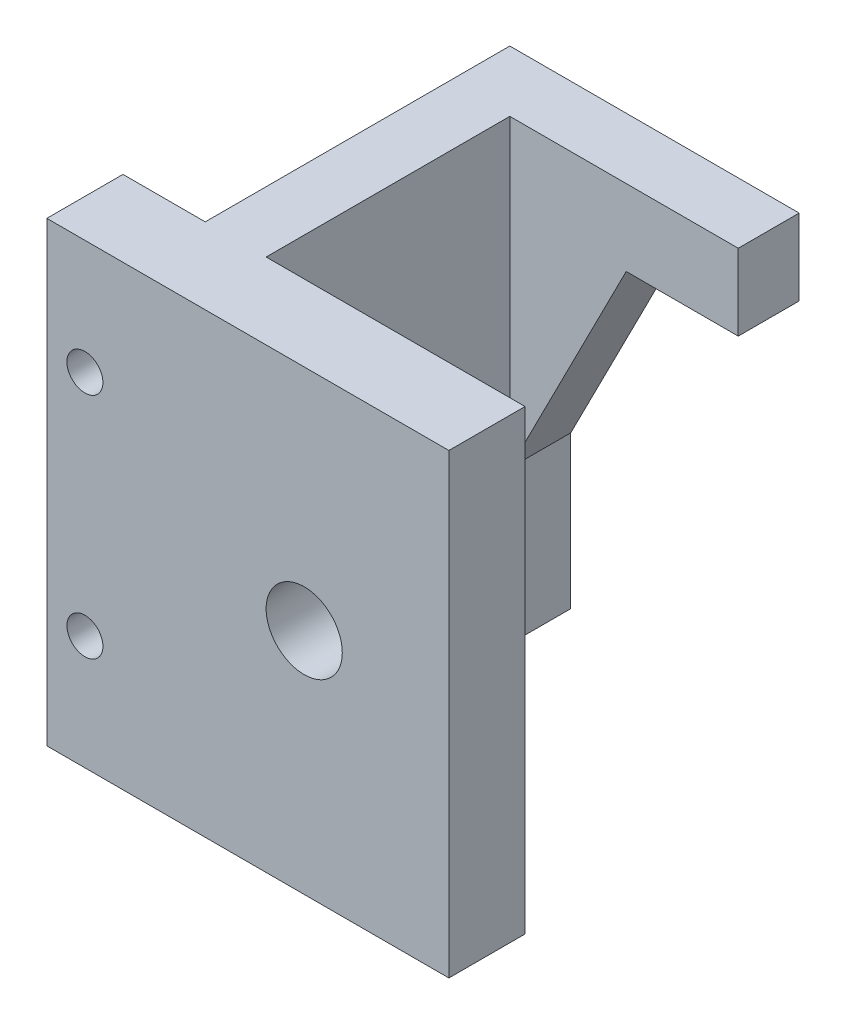
ISO-10303-21;
HEADER;
FILE_DESCRIPTION(('STEP AP214'),'2;1');
FILE_NAME('part.step','',(''),(''),'','','');
FILE_SCHEMA(('AUTOMOTIVE_DESIGN { 1 0 10303 214 1 1 1 1 }'));
ENDSEC;
DATA;
#1=APPLICATION_CONTEXT('core data for automotive mechanical design processes');
#2=APPLICATION_PROTOCOL_DEFINITION('international standard','automotive_design',2000,#1);
#3=PRODUCT_CONTEXT('',#1,'mechanical');
#4=PRODUCT('Part','Part','',(#3));
#5=PRODUCT_RELATED_PRODUCT_CATEGORY('part','',(#4));
#6=PRODUCT_DEFINITION_FORMATION('','',#4);
#7=PRODUCT_DEFINITION_CONTEXT('part definition',#1,'design');
#8=PRODUCT_DEFINITION('design','',#6,#7);
#9=PRODUCT_DEFINITION_SHAPE('','',#8);
#10=(LENGTH_UNIT() NAMED_UNIT(*) SI_UNIT(.MILLI.,.METRE.));
#11=(NAMED_UNIT(*) PLANE_ANGLE_UNIT() SI_UNIT($,.RADIAN.));
#12=(NAMED_UNIT(*) SI_UNIT($,.STERADIAN.) SOLID_ANGLE_UNIT());
#13=UNCERTAINTY_MEASURE_WITH_UNIT(LENGTH_MEASURE(1.E-05),#10,'distance_accuracy_value','');
#14=(GEOMETRIC_REPRESENTATION_CONTEXT(3) GLOBAL_UNCERTAINTY_ASSIGNED_CONTEXT((#13)) GLOBAL_UNIT_ASSIGNED_CONTEXT((#10,
#11,#12)) REPRESENTATION_CONTEXT('',''));
#15=CARTESIAN_POINT('',(0.,0.,0.));
#16=DIRECTION('',(0.,0.,1.));
#17=DIRECTION('',(1.,0.,0.));
#18=AXIS2_PLACEMENT_3D('',#15,#16,#17);
#19=CARTESIAN_POINT('',(19.05,-19.05,3.175));
#20=DIRECTION('',(0.,1.,0.));
#21=DIRECTION('',(0.,0.,1.));
#22=AXIS2_PLACEMENT_3D('',#19,#20,#21);
#23=PLANE('',#22);
#24=DIRECTION('',(-1.,0.,0.));
#25=VECTOR('',#24,1.);
#26=CARTESIAN_POINT('',(0.,-19.05,-28.575));
#27=LINE('',#26,#25);
#28=CARTESIAN_POINT('',(11.938,-19.05,-28.575));
#29=VERTEX_POINT('',#28);
#30=CARTESIAN_POINT('',(6.858,-19.05,-28.575));
#31=VERTEX_POINT('',#30);
#32=EDGE_CURVE('E183',#29,#31,#27,.T.);
#33=ORIENTED_EDGE('',*,*,#32,.F.);
#34=DIRECTION('',(0.,0.,-1.));
#35=VECTOR('',#34,1.);
#36=CARTESIAN_POINT('',(11.938,-19.05,0.));
#37=LINE('',#36,#35);
#38=CARTESIAN_POINT('',(11.938,-19.05,-3.175));
#39=VERTEX_POINT('',#38);
#40=EDGE_CURVE('E62',#39,#29,#37,.T.);
#41=ORIENTED_EDGE('',*,*,#40,.F.);
#42=DIRECTION('',(-1.,0.,0.));
#43=VECTOR('',#42,1.);
#44=CARTESIAN_POINT('',(19.05,-19.05,-3.175));
#45=LINE('',#44,#43);
#46=CARTESIAN_POINT('',(33.528,-19.05,-3.175));
#47=VERTEX_POINT('',#46);
#48=EDGE_CURVE('E242',#47,#39,#45,.T.);
#49=ORIENTED_EDGE('',*,*,#48,.F.);
#50=DIRECTION('',(0.,0.,-1.));
#51=VECTOR('',#50,1.);
#52=CARTESIAN_POINT('',(33.528,-19.05,0.));
#53=LINE('',#52,#51);
#54=CARTESIAN_POINT('',(33.528,-19.05,3.175));
#55=VERTEX_POINT('',#54);
#56=EDGE_CURVE('E184',#55,#47,#53,.T.);
#57=ORIENTED_EDGE('',*,*,#56,.F.);
#58=DIRECTION('',(-1.,0.,0.));
#59=VECTOR('',#58,1.);
#60=CARTESIAN_POINT('',(19.05,-19.05,3.175));
#61=LINE('',#60,#59);
#62=CARTESIAN_POINT('',(0.,-19.05,3.175));
#63=VERTEX_POINT('',#62);
#64=EDGE_CURVE('E244',#55,#63,#61,.T.);
#65=ORIENTED_EDGE('',*,*,#64,.T.);
#66=DIRECTION('',(0.,0.,-1.));
#67=VECTOR('',#66,1.);
#68=CARTESIAN_POINT('',(0.,-19.05,3.175));
#69=LINE('',#68,#67);
#70=CARTESIAN_POINT('',(0.,-19.05,-3.175));
#71=VERTEX_POINT('',#70);
#72=EDGE_CURVE('E238',#63,#71,#69,.T.);
#73=ORIENTED_EDGE('',*,*,#72,.T.);
#74=CARTESIAN_POINT('',(6.858,-19.05,-3.175));
#75=VERTEX_POINT('',#74);
#76=EDGE_CURVE('E241',#75,#71,#45,.T.);
#77=ORIENTED_EDGE('',*,*,#76,.F.);
#78=DIRECTION('',(0.,0.,1.));
#79=VECTOR('',#78,1.);
#80=CARTESIAN_POINT('',(6.858,-19.05,0.));
#81=LINE('',#80,#79);
#82=EDGE_CURVE('E186',#31,#75,#81,.T.);
#83=ORIENTED_EDGE('',*,*,#82,.F.);
#84=EDGE_LOOP('',(#33,#41,#49,#57,#65,#73,#77,#83));
#85=FACE_BOUND('',#84,.T.);
#86=ADVANCED_FACE('F47',(#85),#23,.F.);
#87=CARTESIAN_POINT('',(0.,-60.5150624019788,-23.495));
#88=DIRECTION('',(0.,0.,-1.));
#89=DIRECTION('',(-1.,0.,0.));
#90=AXIS2_PLACEMENT_3D('',#87,#88,#89);
#91=PLANE('',#90);
#92=DIRECTION('',(0.453990499739541,0.891006524188371,0.));
#93=VECTOR('',#92,1.);
#94=CARTESIAN_POINT('',(12.0461191280743,-6.13780426339539,-23.495));
#95=LINE('',#94,#93);
#96=CARTESIAN_POINT('',(11.938,-6.35,-23.495));
#97=VERTEX_POINT('',#96);
#98=CARTESIAN_POINT('',(21.6444598128687,12.7,-23.495));
#99=VERTEX_POINT('',#98);
#100=EDGE_CURVE('E173',#97,#99,#95,.T.);
#101=ORIENTED_EDGE('',*,*,#100,.T.);
#102=DIRECTION('',(1.,0.,0.));
#103=VECTOR('',#102,1.);
#104=CARTESIAN_POINT('',(0.,12.7,-23.495));
#105=LINE('',#104,#103);
#106=CARTESIAN_POINT('',(30.988,12.7,-23.495));
#107=VERTEX_POINT('',#106);
#108=EDGE_CURVE('E155',#99,#107,#105,.T.);
#109=ORIENTED_EDGE('',*,*,#108,.T.);
#110=DIRECTION('',(0.,1.,0.));
#111=VECTOR('',#110,1.);
#112=CARTESIAN_POINT('',(30.988,0.,-23.495));
#113=LINE('',#112,#111);
#114=CARTESIAN_POINT('',(30.988,19.05,-23.495));
#115=VERTEX_POINT('',#114);
#116=EDGE_CURVE('E168',#107,#115,#113,.T.);
#117=ORIENTED_EDGE('',*,*,#116,.T.);
#118=DIRECTION('',(-1.,0.,0.));
#119=VECTOR('',#118,1.);
#120=CARTESIAN_POINT('',(0.,19.05,-23.495));
#121=LINE('',#120,#119);
#122=CARTESIAN_POINT('',(11.938,19.05,-23.495));
#123=VERTEX_POINT('',#122);
#124=EDGE_CURVE('E195',#115,#123,#121,.T.);
#125=ORIENTED_EDGE('',*,*,#124,.T.);
#126=DIRECTION('',(0.,1.,0.));
#127=VECTOR('',#126,1.);
#128=CARTESIAN_POINT('',(11.938,-60.5150624019788,-23.495));
#129=LINE('',#128,#127);
#130=EDGE_CURVE('E206',#97,#123,#129,.T.);
#131=ORIENTED_EDGE('',*,*,#130,.F.);
#132=EDGE_LOOP('',(#101,#109,#117,#125,#131));
#133=FACE_BOUND('',#132,.T.);
#134=ADVANCED_FACE('F290',(#133),#91,.F.);
#135=CARTESIAN_POINT('',(0.,-60.5150624019788,-28.575));
#136=DIRECTION('',(0.,0.,1.));
#137=DIRECTION('',(1.,0.,0.));
#138=AXIS2_PLACEMENT_3D('',#135,#136,#137);
#139=PLANE('',#138);
#140=DIRECTION('',(-0.453990499739541,-0.891006524188371,0.));
#141=VECTOR('',#140,1.);
#142=CARTESIAN_POINT('',(12.0461191280743,-6.13780426339537,-28.575));
#143=LINE('',#142,#141);
#144=CARTESIAN_POINT('',(21.6444598128687,12.7,-28.575));
#145=VERTEX_POINT('',#144);
#146=CARTESIAN_POINT('',(11.938,-6.35,-28.575));
#147=VERTEX_POINT('',#146);
#148=EDGE_CURVE('E138',#145,#147,#143,.T.);
#149=ORIENTED_EDGE('',*,*,#148,.T.);
#150=DIRECTION('',(0.,-1.,0.));
#151=VECTOR('',#150,1.);
#152=CARTESIAN_POINT('',(11.938,0.,-28.575));
#153=LINE('',#152,#151);
#154=EDGE_CURVE('E146',#147,#29,#153,.T.);
#155=ORIENTED_EDGE('',*,*,#154,.T.);
#156=ORIENTED_EDGE('',*,*,#32,.T.);
#157=DIRECTION('',(0.,1.,0.));
#158=VECTOR('',#157,1.);
#159=CARTESIAN_POINT('',(6.858,-60.5150624019788,-28.575));
#160=LINE('',#159,#158);
#161=CARTESIAN_POINT('',(6.858,19.05,-28.575));
#162=VERTEX_POINT('',#161);
#163=EDGE_CURVE('E203',#31,#162,#160,.T.);
#164=ORIENTED_EDGE('',*,*,#163,.T.);
#165=DIRECTION('',(1.,0.,0.));
#166=VECTOR('',#165,1.);
#167=CARTESIAN_POINT('',(0.,19.05,-28.575));
#168=LINE('',#167,#166);
#169=CARTESIAN_POINT('',(30.988,19.05,-28.575));
#170=VERTEX_POINT('',#169);
#171=EDGE_CURVE('E198',#162,#170,#168,.T.);
#172=ORIENTED_EDGE('',*,*,#171,.T.);
#173=DIRECTION('',(0.,-1.,0.));
#174=VECTOR('',#173,1.);
#175=CARTESIAN_POINT('',(30.988,0.,-28.575));
#176=LINE('',#175,#174);
#177=CARTESIAN_POINT('',(30.988,12.7,-28.575));
#178=VERTEX_POINT('',#177);
#179=EDGE_CURVE('E157',#170,#178,#176,.T.);
#180=ORIENTED_EDGE('',*,*,#179,.T.);
#181=DIRECTION('',(-1.,0.,0.));
#182=VECTOR('',#181,1.);
#183=CARTESIAN_POINT('',(0.,12.7,-28.575));
#184=LINE('',#183,#182);
#185=EDGE_CURVE('E153',#178,#145,#184,.T.);
#186=ORIENTED_EDGE('',*,*,#185,.T.);
#187=EDGE_LOOP('',(#149,#155,#156,#164,#172,#180,#186));
#188=FACE_BOUND('',#187,.T.);
#189=ADVANCED_FACE('F159',(#188),#139,.F.);
#190=CARTESIAN_POINT('',(19.05,-19.05,-3.175));
#191=DIRECTION('',(0.,0.,1.));
#192=DIRECTION('',(1.,0.,0.));
#193=AXIS2_PLACEMENT_3D('',#190,#191,#192);
#194=PLANE('',#193);
#195=CARTESIAN_POINT('',(21.463,0.,-3.175));
#196=DIRECTION('',(0.,0.,1.));
#197=DIRECTION('',(1.,0.,0.));
#198=AXIS2_PLACEMENT_3D('',#195,#196,#197);
#199=CIRCLE('',#198,3.175);
#200=CARTESIAN_POINT('',(24.638,0.,-3.175));
#201=VERTEX_POINT('',#200);
#202=EDGE_CURVE('E178',#201,#201,#199,.F.);
#203=ORIENTED_EDGE('',*,*,#202,.F.);
#204=EDGE_LOOP('',(#203));
#205=FACE_BOUND('',#204,.T.);
#206=DIRECTION('',(0.,1.,0.));
#207=VECTOR('',#206,1.);
#208=CARTESIAN_POINT('',(11.938,-60.5150624019788,-3.175));
#209=LINE('',#208,#207);
#210=CARTESIAN_POINT('',(11.938,19.05,-3.175));
#211=VERTEX_POINT('',#210);
#212=EDGE_CURVE('E208',#39,#211,#209,.T.);
#213=ORIENTED_EDGE('',*,*,#212,.T.);
#214=DIRECTION('',(-1.,0.,0.));
#215=VECTOR('',#214,1.);
#216=CARTESIAN_POINT('',(19.05,19.05,-3.175));
#217=LINE('',#216,#215);
#218=CARTESIAN_POINT('',(33.528,19.05,-3.175));
#219=VERTEX_POINT('',#218);
#220=EDGE_CURVE('E11',#219,#211,#217,.T.);
#221=ORIENTED_EDGE('',*,*,#220,.F.);
#222=DIRECTION('',(0.,1.,0.));
#223=VECTOR('',#222,1.);
#224=CARTESIAN_POINT('',(33.528,-60.5150624019788,-3.175));
#225=LINE('',#224,#223);
#226=EDGE_CURVE('E210',#47,#219,#225,.T.);
#227=ORIENTED_EDGE('',*,*,#226,.F.);
#228=ORIENTED_EDGE('',*,*,#48,.T.);
#229=EDGE_LOOP('',(#213,#221,#227,#228));
#230=FACE_BOUND('',#229,.T.);
#231=ADVANCED_FACE('F49',(#205,#230),#194,.F.);
#232=CARTESIAN_POINT('',(3.175,-9.525,-3.175));
#233=DIRECTION('',(0.,0.,1.));
#234=DIRECTION('',(1.,0.,0.));
#235=AXIS2_PLACEMENT_3D('',#232,#233,#234);
#236=CIRCLE('',#235,1.5);
#237=CARTESIAN_POINT('',(4.675,-9.525,-3.175));
#238=VERTEX_POINT('',#237);
#239=EDGE_CURVE('E226',#238,#238,#236,.T.);
#240=ORIENTED_EDGE('',*,*,#239,.T.);
#241=EDGE_LOOP('',(#240));
#242=FACE_BOUND('',#241,.T.);
#243=CARTESIAN_POINT('',(3.175,9.525,-3.175));
#244=DIRECTION('',(0.,0.,1.));
#245=DIRECTION('',(1.,0.,0.));
#246=AXIS2_PLACEMENT_3D('',#243,#244,#245);
#247=CIRCLE('',#246,1.5);
#248=CARTESIAN_POINT('',(4.675,9.525,-3.175));
#249=VERTEX_POINT('',#248);
#250=EDGE_CURVE('E219',#249,#249,#247,.T.);
#251=ORIENTED_EDGE('',*,*,#250,.T.);
#252=EDGE_LOOP('',(#251));
#253=FACE_BOUND('',#252,.T.);
#254=DIRECTION('',(0.,1.,0.));
#255=VECTOR('',#254,1.);
#256=CARTESIAN_POINT('',(6.858,-19.05,-3.175));
#257=LINE('',#256,#255);
#258=CARTESIAN_POINT('',(6.858,19.05,-3.175));
#259=VERTEX_POINT('',#258);
#260=EDGE_CURVE('E189',#75,#259,#257,.T.);
#261=ORIENTED_EDGE('',*,*,#260,.F.);
#262=ORIENTED_EDGE('',*,*,#76,.T.);
#263=DIRECTION('',(0.,1.,0.));
#264=VECTOR('',#263,1.);
#265=CARTESIAN_POINT('',(0.,-19.05,-3.175));
#266=LINE('',#265,#264);
#267=CARTESIAN_POINT('',(0.,19.05,-3.175));
#268=VERTEX_POINT('',#267);
#269=EDGE_CURVE('E222',#71,#268,#266,.T.);
#270=ORIENTED_EDGE('',*,*,#269,.T.);
#271=EDGE_CURVE('E55',#259,#268,#217,.T.);
#272=ORIENTED_EDGE('',*,*,#271,.F.);
#273=EDGE_LOOP('',(#261,#262,#270,#272));
#274=FACE_BOUND('',#273,.T.);
#275=ADVANCED_FACE('F257',(#242,#253,#274),#194,.F.);
#276=CARTESIAN_POINT('',(19.05,19.05,3.175));
#277=DIRECTION('',(0.,-1.,0.));
#278=DIRECTION('',(0.,0.,-1.));
#279=AXIS2_PLACEMENT_3D('',#276,#277,#278);
#280=PLANE('',#279);
#281=ORIENTED_EDGE('',*,*,#220,.T.);
#282=DIRECTION('',(0.,0.,1.));
#283=VECTOR('',#282,1.);
#284=CARTESIAN_POINT('',(11.938,19.05,0.));
#285=LINE('',#284,#283);
#286=EDGE_CURVE('E192',#123,#211,#285,.T.);
#287=ORIENTED_EDGE('',*,*,#286,.F.);
#288=ORIENTED_EDGE('',*,*,#124,.F.);
#289=DIRECTION('',(0.,0.,-1.));
#290=VECTOR('',#289,1.);
#291=CARTESIAN_POINT('',(30.988,19.05,-11.8460570965742));
#292=LINE('',#291,#290);
#293=EDGE_CURVE('E156',#115,#170,#292,.T.);
#294=ORIENTED_EDGE('',*,*,#293,.T.);
#295=ORIENTED_EDGE('',*,*,#171,.F.);
#296=DIRECTION('',(0.,0.,-1.));
#297=VECTOR('',#296,1.);
#298=CARTESIAN_POINT('',(6.858,19.05,0.));
#299=LINE('',#298,#297);
#300=EDGE_CURVE('E200',#259,#162,#299,.T.);
#301=ORIENTED_EDGE('',*,*,#300,.F.);
#302=ORIENTED_EDGE('',*,*,#271,.T.);
#303=DIRECTION('',(0.,0.,1.));
#304=VECTOR('',#303,1.);
#305=CARTESIAN_POINT('',(0.,19.05,3.175));
#306=LINE('',#305,#304);
#307=CARTESIAN_POINT('',(0.,19.05,3.175));
#308=VERTEX_POINT('',#307);
#309=EDGE_CURVE('E232',#268,#308,#306,.T.);
#310=ORIENTED_EDGE('',*,*,#309,.T.);
#311=DIRECTION('',(-1.,0.,0.));
#312=VECTOR('',#311,1.);
#313=CARTESIAN_POINT('',(19.05,19.05,3.175));
#314=LINE('',#313,#312);
#315=CARTESIAN_POINT('',(33.528,19.05,3.175));
#316=VERTEX_POINT('',#315);
#317=EDGE_CURVE('E245',#316,#308,#314,.T.);
#318=ORIENTED_EDGE('',*,*,#317,.F.);
#319=DIRECTION('',(0.,0.,1.));
#320=VECTOR('',#319,1.);
#321=CARTESIAN_POINT('',(33.528,19.05,0.));
#322=LINE('',#321,#320);
#323=EDGE_CURVE('E181',#219,#316,#322,.T.);
#324=ORIENTED_EDGE('',*,*,#323,.F.);
#325=EDGE_LOOP('',(#281,#287,#288,#294,#295,#301,#302,#310,#318,#324));
#326=FACE_BOUND('',#325,.T.);
#327=ADVANCED_FACE('F250',(#326),#280,.F.);
#328=CARTESIAN_POINT('',(19.05,-19.05,3.175));
#329=DIRECTION('',(0.,0.,-1.));
#330=DIRECTION('',(-1.,0.,0.));
#331=AXIS2_PLACEMENT_3D('',#328,#329,#330);
#332=PLANE('',#331);
#333=CARTESIAN_POINT('',(21.463,0.,3.175));
#334=DIRECTION('',(0.,0.,1.));
#335=DIRECTION('',(1.,0.,0.));
#336=AXIS2_PLACEMENT_3D('',#333,#334,#335);
#337=CIRCLE('',#336,3.175);
#338=CARTESIAN_POINT('',(24.638,0.,3.175));
#339=VERTEX_POINT('',#338);
#340=EDGE_CURVE('E175',#339,#339,#337,.T.);
#341=ORIENTED_EDGE('',*,*,#340,.F.);
#342=EDGE_LOOP('',(#341));
#343=FACE_BOUND('',#342,.T.);
#344=ORIENTED_EDGE('',*,*,#317,.T.);
#345=DIRECTION('',(0.,-1.,0.));
#346=VECTOR('',#345,1.);
#347=CARTESIAN_POINT('',(0.,-19.05,3.175));
#348=LINE('',#347,#346);
#349=EDGE_CURVE('E235',#308,#63,#348,.T.);
#350=ORIENTED_EDGE('',*,*,#349,.T.);
#351=ORIENTED_EDGE('',*,*,#64,.F.);
#352=DIRECTION('',(0.,1.,0.));
#353=VECTOR('',#352,1.);
#354=CARTESIAN_POINT('',(33.528,-60.5150624019788,3.175));
#355=LINE('',#354,#353);
#356=EDGE_CURVE('E202',#55,#316,#355,.T.);
#357=ORIENTED_EDGE('',*,*,#356,.T.);
#358=EDGE_LOOP('',(#344,#350,#351,#357));
#359=FACE_BOUND('',#358,.T.);
#360=CARTESIAN_POINT('',(3.175,-9.525,3.175));
#361=DIRECTION('',(0.,0.,1.));
#362=DIRECTION('',(1.,0.,0.));
#363=AXIS2_PLACEMENT_3D('',#360,#361,#362);
#364=CIRCLE('',#363,1.5);
#365=CARTESIAN_POINT('',(4.675,-9.525,3.175));
#366=VERTEX_POINT('',#365);
#367=EDGE_CURVE('E218',#366,#366,#364,.T.);
#368=ORIENTED_EDGE('',*,*,#367,.F.);
#369=EDGE_LOOP('',(#368));
#370=FACE_BOUND('',#369,.T.);
#371=CARTESIAN_POINT('',(3.175,9.525,3.175));
#372=DIRECTION('',(0.,0.,1.));
#373=DIRECTION('',(1.,0.,0.));
#374=AXIS2_PLACEMENT_3D('',#371,#372,#373);
#375=CIRCLE('',#374,1.5);
#376=CARTESIAN_POINT('',(4.675,9.525,3.175));
#377=VERTEX_POINT('',#376);
#378=EDGE_CURVE('E223',#377,#377,#375,.T.);
#379=ORIENTED_EDGE('',*,*,#378,.F.);
#380=EDGE_LOOP('',(#379));
#381=FACE_BOUND('',#380,.T.);
#382=ADVANCED_FACE('F263',(#343,#359,#370,#381),#332,.F.);
#383=CARTESIAN_POINT('',(0.,0.,0.));
#384=DIRECTION('',(-1.,0.,0.));
#385=DIRECTION('',(0.,0.,1.));
#386=AXIS2_PLACEMENT_3D('',#383,#384,#385);
#387=PLANE('',#386);
#388=ORIENTED_EDGE('',*,*,#269,.F.);
#389=ORIENTED_EDGE('',*,*,#72,.F.);
#390=ORIENTED_EDGE('',*,*,#349,.F.);
#391=ORIENTED_EDGE('',*,*,#309,.F.);
#392=EDGE_LOOP('',(#388,#389,#390,#391));
#393=FACE_BOUND('',#392,.T.);
#394=ADVANCED_FACE('F255',(#393),#387,.T.);
#395=CARTESIAN_POINT('',(3.175,-9.525,-3.175));
#396=DIRECTION('',(0.,0.,1.));
#397=DIRECTION('',(1.,0.,0.));
#398=AXIS2_PLACEMENT_3D('',#395,#396,#397);
#399=CYLINDRICAL_SURFACE('',#398,1.5);
#400=ORIENTED_EDGE('',*,*,#239,.F.);
#401=EDGE_LOOP('',(#400));
#402=FACE_BOUND('',#401,.T.);
#403=ORIENTED_EDGE('',*,*,#367,.T.);
#404=EDGE_LOOP('',(#403));
#405=FACE_BOUND('',#404,.T.);
#406=ADVANCED_FACE('F275',(#402,#405),#399,.F.);
#407=CARTESIAN_POINT('',(3.175,9.525,-3.175));
#408=DIRECTION('',(0.,0.,1.));
#409=DIRECTION('',(1.,0.,0.));
#410=AXIS2_PLACEMENT_3D('',#407,#408,#409);
#411=CYLINDRICAL_SURFACE('',#410,1.5);
#412=ORIENTED_EDGE('',*,*,#250,.F.);
#413=EDGE_LOOP('',(#412));
#414=FACE_BOUND('',#413,.T.);
#415=ORIENTED_EDGE('',*,*,#378,.T.);
#416=EDGE_LOOP('',(#415));
#417=FACE_BOUND('',#416,.T.);
#418=ADVANCED_FACE('F272',(#414,#417),#411,.F.);
#419=CARTESIAN_POINT('',(33.528,-60.5150624019788,0.));
#420=DIRECTION('',(-1.,0.,0.));
#421=DIRECTION('',(0.,0.,1.));
#422=AXIS2_PLACEMENT_3D('',#419,#420,#421);
#423=PLANE('',#422);
#424=ORIENTED_EDGE('',*,*,#356,.F.);
#425=ORIENTED_EDGE('',*,*,#56,.T.);
#426=ORIENTED_EDGE('',*,*,#226,.T.);
#427=ORIENTED_EDGE('',*,*,#323,.T.);
#428=EDGE_LOOP('',(#424,#425,#426,#427));
#429=FACE_BOUND('',#428,.T.);
#430=ADVANCED_FACE('F274',(#429),#423,.F.);
#431=CARTESIAN_POINT('',(6.858,-60.5150624019788,0.));
#432=DIRECTION('',(1.,0.,0.));
#433=DIRECTION('',(0.,0.,-1.));
#434=AXIS2_PLACEMENT_3D('',#431,#432,#433);
#435=PLANE('',#434);
#436=ORIENTED_EDGE('',*,*,#82,.T.);
#437=ORIENTED_EDGE('',*,*,#260,.T.);
#438=ORIENTED_EDGE('',*,*,#300,.T.);
#439=ORIENTED_EDGE('',*,*,#163,.F.);
#440=EDGE_LOOP('',(#436,#437,#438,#439));
#441=FACE_BOUND('',#440,.T.);
#442=ADVANCED_FACE('F283',(#441),#435,.F.);
#443=CARTESIAN_POINT('',(11.938,-60.5150624019788,0.));
#444=DIRECTION('',(-1.,0.,0.));
#445=DIRECTION('',(0.,0.,1.));
#446=AXIS2_PLACEMENT_3D('',#443,#444,#445);
#447=PLANE('',#446);
#448=ORIENTED_EDGE('',*,*,#212,.F.);
#449=ORIENTED_EDGE('',*,*,#40,.T.);
#450=ORIENTED_EDGE('',*,*,#154,.F.);
#451=DIRECTION('',(0.,0.,-1.));
#452=VECTOR('',#451,1.);
#453=CARTESIAN_POINT('',(11.938,-6.35,9.3120173699997));
#454=LINE('',#453,#452);
#455=EDGE_CURVE('E143',#97,#147,#454,.T.);
#456=ORIENTED_EDGE('',*,*,#455,.F.);
#457=ORIENTED_EDGE('',*,*,#130,.T.);
#458=ORIENTED_EDGE('',*,*,#286,.T.);
#459=EDGE_LOOP('',(#448,#449,#450,#456,#457,#458));
#460=FACE_BOUND('',#459,.T.);
#461=ADVANCED_FACE('F322',(#460),#447,.F.);
#462=CARTESIAN_POINT('',(21.463,0.,-12.1552561210692));
#463=DIRECTION('',(0.,0.,1.));
#464=DIRECTION('',(1.,0.,0.));
#465=AXIS2_PLACEMENT_3D('',#462,#463,#464);
#466=CYLINDRICAL_SURFACE('',#465,3.175);
#467=CARTESIAN_POINT('',(24.638,0.,-3.175));
#468=CARTESIAN_POINT('',(24.638,0.,-3.10885416666667));
#469=CARTESIAN_POINT('',(24.638,0.,-3.04270833333334));
#470=CARTESIAN_POINT('',(24.638,0.,-2.91041666666667));
#471=CARTESIAN_POINT('',(24.638,0.,-2.84427083333334));
#472=CARTESIAN_POINT('',(24.638,0.,-2.71197916666667));
#473=CARTESIAN_POINT('',(24.638,0.,-2.64583333333334));
#474=CARTESIAN_POINT('',(24.638,0.,-2.51354166666667));
#475=CARTESIAN_POINT('',(24.638,0.,-2.44739583333334));
#476=CARTESIAN_POINT('',(24.638,0.,-2.31510416666667));
#477=CARTESIAN_POINT('',(24.638,0.,-2.24895833333334));
#478=CARTESIAN_POINT('',(24.638,0.,-2.11666666666667));
#479=CARTESIAN_POINT('',(24.638,0.,-2.05052083333334));
#480=CARTESIAN_POINT('',(24.638,0.,-1.91822916666667));
#481=CARTESIAN_POINT('',(24.638,0.,-1.85208333333334));
#482=CARTESIAN_POINT('',(24.638,0.,-1.71979166666667));
#483=CARTESIAN_POINT('',(24.638,0.,-1.65364583333334));
#484=CARTESIAN_POINT('',(24.638,0.,-1.52135416666667));
#485=CARTESIAN_POINT('',(24.638,0.,-1.45520833333333));
#486=CARTESIAN_POINT('',(24.638,0.,-1.32291666666667));
#487=CARTESIAN_POINT('',(24.638,0.,-1.25677083333334));
#488=CARTESIAN_POINT('',(24.638,0.,-1.12447916666667));
#489=CARTESIAN_POINT('',(24.638,0.,-1.05833333333334));
#490=CARTESIAN_POINT('',(24.638,0.,-0.926041666666668));
#491=CARTESIAN_POINT('',(24.638,0.,-0.859895833333335));
#492=CARTESIAN_POINT('',(24.638,0.,-0.727604166666668));
#493=CARTESIAN_POINT('',(24.638,0.,-0.661458333333335));
#494=CARTESIAN_POINT('',(24.638,0.,-0.529166666666669));
#495=CARTESIAN_POINT('',(24.638,0.,-0.463020833333335));
#496=CARTESIAN_POINT('',(24.638,0.,-0.330729166666668));
#497=CARTESIAN_POINT('',(24.638,0.,-0.264583333333334));
#498=CARTESIAN_POINT('',(24.638,0.,-0.132291666666668));
#499=CARTESIAN_POINT('',(24.638,0.,-0.0661458333333347));
#500=CARTESIAN_POINT('',(24.638,0.,0.0661458333333313));
#501=CARTESIAN_POINT('',(24.638,0.,0.132291666666664));
#502=CARTESIAN_POINT('',(24.638,0.,0.264583333333331));
#503=CARTESIAN_POINT('',(24.638,0.,0.330729166666664));
#504=CARTESIAN_POINT('',(24.638,0.,0.463020833333331));
#505=CARTESIAN_POINT('',(24.638,0.,0.529166666666665));
#506=CARTESIAN_POINT('',(24.638,0.,0.661458333333332));
#507=CARTESIAN_POINT('',(24.638,0.,0.727604166666665));
#508=CARTESIAN_POINT('',(24.638,0.,0.859895833333331));
#509=CARTESIAN_POINT('',(24.638,0.,0.926041666666665));
#510=CARTESIAN_POINT('',(24.638,0.,1.05833333333333));
#511=CARTESIAN_POINT('',(24.638,0.,1.12447916666667));
#512=CARTESIAN_POINT('',(24.638,0.,1.25677083333333));
#513=CARTESIAN_POINT('',(24.638,0.,1.32291666666666));
#514=CARTESIAN_POINT('',(24.638,0.,1.45520833333333));
#515=CARTESIAN_POINT('',(24.638,0.,1.52135416666667));
#516=CARTESIAN_POINT('',(24.638,0.,1.65364583333333));
#517=CARTESIAN_POINT('',(24.638,0.,1.71979166666667));
#518=CARTESIAN_POINT('',(24.638,0.,1.85208333333333));
#519=CARTESIAN_POINT('',(24.638,0.,1.91822916666667));
#520=CARTESIAN_POINT('',(24.638,0.,2.05052083333333));
#521=CARTESIAN_POINT('',(24.638,0.,2.11666666666667));
#522=CARTESIAN_POINT('',(24.638,0.,2.24895833333333));
#523=CARTESIAN_POINT('',(24.638,0.,2.31510416666667));
#524=CARTESIAN_POINT('',(24.638,0.,2.44739583333333));
#525=CARTESIAN_POINT('',(24.638,0.,2.51354166666667));
#526=CARTESIAN_POINT('',(24.638,0.,2.64583333333333));
#527=CARTESIAN_POINT('',(24.638,0.,2.71197916666667));
#528=CARTESIAN_POINT('',(24.638,0.,2.84427083333333));
#529=CARTESIAN_POINT('',(24.638,0.,2.91041666666667));
#530=CARTESIAN_POINT('',(24.638,0.,3.04270833333333));
#531=CARTESIAN_POINT('',(24.638,0.,3.10885416666667));
#532=CARTESIAN_POINT('',(24.638,0.,3.175));
#533=B_SPLINE_CURVE_WITH_KNOTS('',3,(#467,#468,#469,#470,#471,#472,#473,#474,#475,#476,#477,
#478,#479,#480,#481,#482,#483,#484,#485,#486,#487,#488,#489,#490,#491,#492,#493,#494,#495,#496,
#497,#498,#499,#500,#501,#502,#503,#504,#505,#506,#507,#508,#509,#510,#511,#512,#513,#514,#515,
#516,#517,#518,#519,#520,#521,#522,#523,#524,#525,#526,#527,#528,#529,#530,#531,#532),
.UNSPECIFIED.,.F.,.F.,(4,2,2,2,2,2,2,2,2,2,2,2,2,2,2,2,2,2,2,2,2,2,2,2,2,2,2,2,2,2,2,2,4),(0.,
0.198437500000001,0.396875,0.5953125,0.793749999999999,0.9921875,1.190625,1.3890625,1.5875,
1.7859375,1.984375,2.1828125,2.38125,2.5796875,2.778125,2.9765625,3.175,3.3734375,3.571875,
3.7703125,3.96875,4.1671875,4.365625,4.5640625,4.7625,4.9609375,5.159375,5.3578125,5.55625,
5.7546875,5.953125,6.1515625,6.35),.UNSPECIFIED.);
#534=EDGE_CURVE('BSEAM337',#201,#339,#533,.T.);
#535=ORIENTED_EDGE('',*,*,#202,.T.);
#536=ORIENTED_EDGE('',*,*,#340,.T.);
#537=ORIENTED_EDGE('',*,*,#534,.T.);
#538=ORIENTED_EDGE('',*,*,#534,.F.);
#539=EDGE_LOOP('',(#535,#537,#536,#538));
#540=FACE_BOUND('',#539,.T.);
#541=ADVANCED_FACE('F337',(#540),#466,.F.);
#542=CARTESIAN_POINT('',(12.0461191280742,-6.13780426339537,9.3120173699997));
#543=DIRECTION('',(0.891006524188371,-0.453990499739541,0.));
#544=DIRECTION('',(0.453990499739541,0.891006524188371,0.));
#545=AXIS2_PLACEMENT_3D('',#542,#543,#544);
#546=PLANE('',#545);
#547=ORIENTED_EDGE('',*,*,#455,.T.);
#548=ORIENTED_EDGE('',*,*,#148,.F.);
#549=DIRECTION('',(0.,0.,-1.));
#550=VECTOR('',#549,1.);
#551=CARTESIAN_POINT('',(21.6444598128687,12.7,-11.8460570965742));
#552=LINE('',#551,#550);
#553=EDGE_CURVE('E141',#99,#145,#552,.T.);
#554=ORIENTED_EDGE('',*,*,#553,.F.);
#555=ORIENTED_EDGE('',*,*,#100,.F.);
#556=EDGE_LOOP('',(#547,#548,#554,#555));
#557=FACE_BOUND('',#556,.T.);
#558=ADVANCED_FACE('F140',(#557),#546,.T.);
#559=CARTESIAN_POINT('',(0.,12.7,-11.8460570965742));
#560=DIRECTION('',(0.,-1.,0.));
#561=DIRECTION('',(0.,0.,-1.));
#562=AXIS2_PLACEMENT_3D('',#559,#560,#561);
#563=PLANE('',#562);
#564=ORIENTED_EDGE('',*,*,#108,.F.);
#565=ORIENTED_EDGE('',*,*,#553,.T.);
#566=ORIENTED_EDGE('',*,*,#185,.F.);
#567=DIRECTION('',(0.,0.,-1.));
#568=VECTOR('',#567,1.);
#569=CARTESIAN_POINT('',(30.988,12.7,-11.8460570965742));
#570=LINE('',#569,#568);
#571=EDGE_CURVE('E166',#107,#178,#570,.T.);
#572=ORIENTED_EDGE('',*,*,#571,.F.);
#573=EDGE_LOOP('',(#564,#565,#566,#572));
#574=FACE_BOUND('',#573,.T.);
#575=ADVANCED_FACE('F151',(#574),#563,.T.);
#576=CARTESIAN_POINT('',(30.988,0.,-11.8460570965742));
#577=DIRECTION('',(1.,0.,0.));
#578=DIRECTION('',(0.,0.,-1.));
#579=AXIS2_PLACEMENT_3D('',#576,#577,#578);
#580=PLANE('',#579);
#581=ORIENTED_EDGE('',*,*,#116,.F.);
#582=ORIENTED_EDGE('',*,*,#571,.T.);
#583=ORIENTED_EDGE('',*,*,#179,.F.);
#584=ORIENTED_EDGE('',*,*,#293,.F.);
#585=EDGE_LOOP('',(#581,#582,#583,#584));
#586=FACE_BOUND('',#585,.T.);
#587=ADVANCED_FACE('F328',(#586),#580,.T.);
#588=CLOSED_SHELL('',(#86,#134,#189,#231,#275,#327,#382,#394,#406,#418,#430,#442,#461,#541,#558,
#575,#587));
#589=MANIFOLD_SOLID_BREP('B2',#588);
#590=ADVANCED_BREP_SHAPE_REPRESENTATION('',(#18,#589),#14);
#591=SHAPE_DEFINITION_REPRESENTATION(#9,#590);
ENDSEC;
END-ISO-10303-21;
